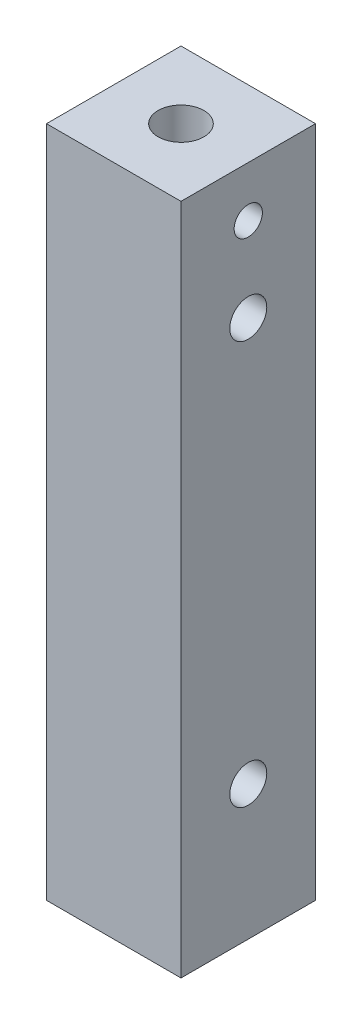
ISO-10303-21;
HEADER;
FILE_DESCRIPTION(('STEP AP214'),'2;1');
FILE_NAME('part.step','',(''),(''),'','','');
FILE_SCHEMA(('AUTOMOTIVE_DESIGN { 1 0 10303 214 1 1 1 1 }'));
ENDSEC;
DATA;
#1=APPLICATION_CONTEXT('core data for automotive mechanical design processes');
#2=APPLICATION_PROTOCOL_DEFINITION('international standard','automotive_design',2000,#1);
#3=PRODUCT_CONTEXT('',#1,'mechanical');
#4=PRODUCT('Part','Part','',(#3));
#5=PRODUCT_RELATED_PRODUCT_CATEGORY('part','',(#4));
#6=PRODUCT_DEFINITION_FORMATION('','',#4);
#7=PRODUCT_DEFINITION_CONTEXT('part definition',#1,'design');
#8=PRODUCT_DEFINITION('design','',#6,#7);
#9=PRODUCT_DEFINITION_SHAPE('','',#8);
#10=(LENGTH_UNIT() NAMED_UNIT(*) SI_UNIT(.MILLI.,.METRE.));
#11=(NAMED_UNIT(*) PLANE_ANGLE_UNIT() SI_UNIT($,.RADIAN.));
#12=(NAMED_UNIT(*) SI_UNIT($,.STERADIAN.) SOLID_ANGLE_UNIT());
#13=UNCERTAINTY_MEASURE_WITH_UNIT(LENGTH_MEASURE(1.E-05),#10,'distance_accuracy_value','');
#14=(GEOMETRIC_REPRESENTATION_CONTEXT(3) GLOBAL_UNCERTAINTY_ASSIGNED_CONTEXT((#13)) GLOBAL_UNIT_ASSIGNED_CONTEXT((#10,
#11,#12)) REPRESENTATION_CONTEXT('',''));
#15=CARTESIAN_POINT('',(0.,0.,0.));
#16=DIRECTION('',(0.,0.,1.));
#17=DIRECTION('',(1.,0.,0.));
#18=AXIS2_PLACEMENT_3D('',#15,#16,#17);
#19=CARTESIAN_POINT('',(20.,100.,0.));
#20=DIRECTION('',(-1.,0.,0.));
#21=DIRECTION('',(0.,0.,1.));
#22=AXIS2_PLACEMENT_3D('',#19,#20,#21);
#23=PLANE('',#22);
#24=CARTESIAN_POINT('',(20.,80.,-10.));
#25=DIRECTION('',(1.,0.,0.));
#26=DIRECTION('',(0.,0.,-1.));
#27=AXIS2_PLACEMENT_3D('',#24,#25,#26);
#28=CIRCLE('',#27,2.75);
#29=CARTESIAN_POINT('',(20.,80.,-12.75));
#30=VERTEX_POINT('',#29);
#31=EDGE_CURVE('E203',#30,#30,#28,.T.);
#32=ORIENTED_EDGE('',*,*,#31,.F.);
#33=EDGE_LOOP('',(#32));
#34=FACE_BOUND('',#33,.T.);
#35=CARTESIAN_POINT('',(20.,20.,-10.));
#36=DIRECTION('',(1.,0.,0.));
#37=DIRECTION('',(0.,0.,-1.));
#38=AXIS2_PLACEMENT_3D('',#35,#36,#37);
#39=CIRCLE('',#38,2.75);
#40=CARTESIAN_POINT('',(20.,20.,-12.75));
#41=VERTEX_POINT('',#40);
#42=EDGE_CURVE('E206',#41,#41,#39,.T.);
#43=ORIENTED_EDGE('',*,*,#42,.F.);
#44=EDGE_LOOP('',(#43));
#45=FACE_BOUND('',#44,.T.);
#46=DIRECTION('',(0.,0.,-1.));
#47=VECTOR('',#46,1.);
#48=CARTESIAN_POINT('',(20.,0.,0.));
#49=LINE('',#48,#47);
#50=CARTESIAN_POINT('',(20.,0.,0.));
#51=VERTEX_POINT('',#50);
#52=CARTESIAN_POINT('',(20.,0.,-20.));
#53=VERTEX_POINT('',#52);
#54=EDGE_CURVE('E98',#51,#53,#49,.T.);
#55=ORIENTED_EDGE('',*,*,#54,.T.);
#56=DIRECTION('',(0.,-1.,0.));
#57=VECTOR('',#56,1.);
#58=CARTESIAN_POINT('',(20.,100.,-20.));
#59=LINE('',#58,#57);
#60=CARTESIAN_POINT('',(20.,100.,-20.));
#61=VERTEX_POINT('',#60);
#62=EDGE_CURVE('E169',#61,#53,#59,.T.);
#63=ORIENTED_EDGE('',*,*,#62,.F.);
#64=DIRECTION('',(0.,0.,-1.));
#65=VECTOR('',#64,1.);
#66=CARTESIAN_POINT('',(20.,100.,0.));
#67=LINE('',#66,#65);
#68=CARTESIAN_POINT('',(20.,100.,0.));
#69=VERTEX_POINT('',#68);
#70=EDGE_CURVE('E151',#69,#61,#67,.T.);
#71=ORIENTED_EDGE('',*,*,#70,.F.);
#72=DIRECTION('',(0.,-1.,0.));
#73=VECTOR('',#72,1.);
#74=CARTESIAN_POINT('',(20.,100.,0.));
#75=LINE('',#74,#73);
#76=EDGE_CURVE('E72',#69,#51,#75,.T.);
#77=ORIENTED_EDGE('',*,*,#76,.T.);
#78=EDGE_LOOP('',(#55,#63,#71,#77));
#79=FACE_BOUND('',#78,.T.);
#80=CARTESIAN_POINT('',(20.,92.5,-10.));
#81=DIRECTION('',(1.,0.,0.));
#82=DIRECTION('',(0.,0.,-1.));
#83=AXIS2_PLACEMENT_3D('',#80,#81,#82);
#84=CIRCLE('',#83,2.09999999999999);
#85=CARTESIAN_POINT('',(20.,92.5,-12.1));
#86=VERTEX_POINT('',#85);
#87=EDGE_CURVE('E219',#86,#86,#84,.T.);
#88=ORIENTED_EDGE('',*,*,#87,.F.);
#89=EDGE_LOOP('',(#88));
#90=FACE_BOUND('',#89,.T.);
#91=ADVANCED_FACE('F56',(#34,#45,#79,#90),#23,.F.);
#92=CARTESIAN_POINT('',(0.,100.,0.));
#93=DIRECTION('',(1.,0.,0.));
#94=DIRECTION('',(0.,0.,-1.));
#95=AXIS2_PLACEMENT_3D('',#92,#93,#94);
#96=PLANE('',#95);
#97=CARTESIAN_POINT('',(0.,80.,-10.));
#98=DIRECTION('',(1.,0.,0.));
#99=DIRECTION('',(0.,0.,-1.));
#100=AXIS2_PLACEMENT_3D('',#97,#98,#99);
#101=CIRCLE('',#100,2.74999999999999);
#102=CARTESIAN_POINT('',(0.,80.,-12.75));
#103=VERTEX_POINT('',#102);
#104=EDGE_CURVE('E209',#103,#103,#101,.T.);
#105=ORIENTED_EDGE('',*,*,#104,.T.);
#106=EDGE_LOOP('',(#105));
#107=FACE_BOUND('',#106,.T.);
#108=CARTESIAN_POINT('',(0.,20.,-10.));
#109=DIRECTION('',(1.,0.,0.));
#110=DIRECTION('',(0.,0.,-1.));
#111=AXIS2_PLACEMENT_3D('',#108,#109,#110);
#112=CIRCLE('',#111,2.75);
#113=CARTESIAN_POINT('',(0.,20.,-12.75));
#114=VERTEX_POINT('',#113);
#115=EDGE_CURVE('E138',#114,#114,#112,.T.);
#116=ORIENTED_EDGE('',*,*,#115,.T.);
#117=EDGE_LOOP('',(#116));
#118=FACE_BOUND('',#117,.T.);
#119=DIRECTION('',(0.,0.,1.));
#120=VECTOR('',#119,1.);
#121=CARTESIAN_POINT('',(0.,0.,0.));
#122=LINE('',#121,#120);
#123=CARTESIAN_POINT('',(0.,0.,-20.));
#124=VERTEX_POINT('',#123);
#125=CARTESIAN_POINT('',(0.,0.,0.));
#126=VERTEX_POINT('',#125);
#127=EDGE_CURVE('E145',#124,#126,#122,.T.);
#128=ORIENTED_EDGE('',*,*,#127,.T.);
#129=DIRECTION('',(0.,-1.,0.));
#130=VECTOR('',#129,1.);
#131=CARTESIAN_POINT('',(0.,100.,0.));
#132=LINE('',#131,#130);
#133=CARTESIAN_POINT('',(0.,100.,0.));
#134=VERTEX_POINT('',#133);
#135=EDGE_CURVE('E13',#134,#126,#132,.T.);
#136=ORIENTED_EDGE('',*,*,#135,.F.);
#137=DIRECTION('',(0.,0.,1.));
#138=VECTOR('',#137,1.);
#139=CARTESIAN_POINT('',(0.,100.,0.));
#140=LINE('',#139,#138);
#141=CARTESIAN_POINT('',(0.,100.,-20.));
#142=VERTEX_POINT('',#141);
#143=EDGE_CURVE('E146',#142,#134,#140,.T.);
#144=ORIENTED_EDGE('',*,*,#143,.F.);
#145=DIRECTION('',(0.,-1.,0.));
#146=VECTOR('',#145,1.);
#147=CARTESIAN_POINT('',(0.,100.,-20.));
#148=LINE('',#147,#146);
#149=EDGE_CURVE('E156',#142,#124,#148,.T.);
#150=ORIENTED_EDGE('',*,*,#149,.T.);
#151=EDGE_LOOP('',(#128,#136,#144,#150));
#152=FACE_BOUND('',#151,.T.);
#153=ADVANCED_FACE('F58',(#107,#118,#152),#96,.F.);
#154=CARTESIAN_POINT('',(0.,100.,0.));
#155=DIRECTION('',(0.,0.,-1.));
#156=DIRECTION('',(-1.,0.,0.));
#157=AXIS2_PLACEMENT_3D('',#154,#155,#156);
#158=PLANE('',#157);
#159=DIRECTION('',(1.,0.,0.));
#160=VECTOR('',#159,1.);
#161=CARTESIAN_POINT('',(0.,0.,0.));
#162=LINE('',#161,#160);
#163=EDGE_CURVE('E160',#126,#51,#162,.T.);
#164=ORIENTED_EDGE('',*,*,#163,.T.);
#165=ORIENTED_EDGE('',*,*,#76,.F.);
#166=DIRECTION('',(1.,0.,0.));
#167=VECTOR('',#166,1.);
#168=CARTESIAN_POINT('',(0.,100.,0.));
#169=LINE('',#168,#167);
#170=EDGE_CURVE('E111',#134,#69,#169,.T.);
#171=ORIENTED_EDGE('',*,*,#170,.F.);
#172=ORIENTED_EDGE('',*,*,#135,.T.);
#173=EDGE_LOOP('',(#164,#165,#171,#172));
#174=FACE_BOUND('',#173,.T.);
#175=ADVANCED_FACE('F184',(#174),#158,.F.);
#176=CARTESIAN_POINT('',(0.,100.,-20.));
#177=DIRECTION('',(0.,0.,1.));
#178=DIRECTION('',(1.,0.,0.));
#179=AXIS2_PLACEMENT_3D('',#176,#177,#178);
#180=PLANE('',#179);
#181=DIRECTION('',(-1.,0.,0.));
#182=VECTOR('',#181,1.);
#183=CARTESIAN_POINT('',(0.,0.,-20.));
#184=LINE('',#183,#182);
#185=EDGE_CURVE('E104',#53,#124,#184,.T.);
#186=ORIENTED_EDGE('',*,*,#185,.T.);
#187=ORIENTED_EDGE('',*,*,#149,.F.);
#188=DIRECTION('',(-1.,0.,0.));
#189=VECTOR('',#188,1.);
#190=CARTESIAN_POINT('',(0.,100.,-20.));
#191=LINE('',#190,#189);
#192=EDGE_CURVE('E80',#61,#142,#191,.T.);
#193=ORIENTED_EDGE('',*,*,#192,.F.);
#194=ORIENTED_EDGE('',*,*,#62,.T.);
#195=EDGE_LOOP('',(#186,#187,#193,#194));
#196=FACE_BOUND('',#195,.T.);
#197=ADVANCED_FACE('F181',(#196),#180,.F.);
#198=CARTESIAN_POINT('',(0.,100.,0.));
#199=DIRECTION('',(0.,-1.,0.));
#200=DIRECTION('',(0.,0.,-1.));
#201=AXIS2_PLACEMENT_3D('',#198,#199,#200);
#202=PLANE('',#201);
#203=CARTESIAN_POINT('',(10.,100.,-10.));
#204=DIRECTION('',(0.,1.,0.));
#205=DIRECTION('',(0.,0.,1.));
#206=AXIS2_PLACEMENT_3D('',#203,#204,#205);
#207=CIRCLE('',#206,3.39999999999999);
#208=CARTESIAN_POINT('',(10.,100.,-6.60000000000001));
#209=VERTEX_POINT('',#208);
#210=EDGE_CURVE('E129',#209,#209,#207,.T.);
#211=ORIENTED_EDGE('',*,*,#210,.F.);
#212=EDGE_LOOP('',(#211));
#213=FACE_BOUND('',#212,.T.);
#214=ORIENTED_EDGE('',*,*,#143,.T.);
#215=ORIENTED_EDGE('',*,*,#170,.T.);
#216=ORIENTED_EDGE('',*,*,#70,.T.);
#217=ORIENTED_EDGE('',*,*,#192,.T.);
#218=EDGE_LOOP('',(#214,#215,#216,#217));
#219=FACE_BOUND('',#218,.T.);
#220=ADVANCED_FACE('F183',(#213,#219),#202,.F.);
#221=CARTESIAN_POINT('',(0.,0.,0.));
#222=DIRECTION('',(0.,-1.,0.));
#223=DIRECTION('',(0.,0.,-1.));
#224=AXIS2_PLACEMENT_3D('',#221,#222,#223);
#225=PLANE('',#224);
#226=CARTESIAN_POINT('',(10.,0.,-10.));
#227=DIRECTION('',(0.,-1.,0.));
#228=DIRECTION('',(0.,0.,-1.));
#229=AXIS2_PLACEMENT_3D('',#226,#227,#228);
#230=CIRCLE('',#229,3.39999999999999);
#231=CARTESIAN_POINT('',(10.,0.,-13.4));
#232=VERTEX_POINT('',#231);
#233=EDGE_CURVE('E130',#232,#232,#230,.T.);
#234=ORIENTED_EDGE('',*,*,#233,.F.);
#235=EDGE_LOOP('',(#234));
#236=FACE_BOUND('',#235,.T.);
#237=ORIENTED_EDGE('',*,*,#127,.F.);
#238=ORIENTED_EDGE('',*,*,#185,.F.);
#239=ORIENTED_EDGE('',*,*,#54,.F.);
#240=ORIENTED_EDGE('',*,*,#163,.F.);
#241=EDGE_LOOP('',(#237,#238,#239,#240));
#242=FACE_BOUND('',#241,.T.);
#243=ADVANCED_FACE('F177',(#236,#242),#225,.T.);
#244=CARTESIAN_POINT('',(10.,86.25,-10.));
#245=DIRECTION('',(0.,1.,0.));
#246=DIRECTION('',(0.,0.,1.));
#247=AXIS2_PLACEMENT_3D('',#244,#245,#246);
#248=CONICAL_SURFACE('',#247,3.4,1.02974425867665);
#249=CARTESIAN_POINT('',(10.,84.2070738953063,-10.));
#250=VERTEX_POINT('',#249);
#251=VERTEX_LOOP('',#250);
#252=FACE_BOUND('',#251,.T.);
#253=CARTESIAN_POINT('',(10.,86.25,-10.));
#254=DIRECTION('',(0.,1.,0.));
#255=DIRECTION('',(0.,0.,1.));
#256=AXIS2_PLACEMENT_3D('',#253,#254,#255);
#257=CIRCLE('',#256,3.4);
#258=CARTESIAN_POINT('',(10.,86.25,-6.6));
#259=VERTEX_POINT('',#258);
#260=EDGE_CURVE('E135',#259,#259,#257,.T.);
#261=ORIENTED_EDGE('',*,*,#260,.T.);
#262=EDGE_LOOP('',(#261));
#263=FACE_BOUND('',#262,.T.);
#264=ADVANCED_FACE('F248',(#252,#263),#248,.F.);
#265=CARTESIAN_POINT('',(10.,100.,-10.));
#266=DIRECTION('',(0.,1.,0.));
#267=DIRECTION('',(0.,0.,1.));
#268=AXIS2_PLACEMENT_3D('',#265,#266,#267);
#269=CYLINDRICAL_SURFACE('',#268,3.39999999999999);
#270=CARTESIAN_POINT('',(12.6739483914242,92.5,-12.1));
#271=CARTESIAN_POINT('',(12.6739610113809,92.6046790422649,-12.0999918862109));
#272=CARTESIAN_POINT('',(12.6802093934933,92.7095349338581,-12.0921018484001));
#273=CARTESIAN_POINT('',(12.7041179400223,92.9157500842561,-12.0610919822798));
#274=CARTESIAN_POINT('',(12.7218106974976,93.0170984826818,-12.03792865267));
#275=CARTESIAN_POINT('',(12.7656635883293,93.212687802904,-11.9779929515485));
#276=CARTESIAN_POINT('',(12.7917515972957,93.3069811221234,-11.9413361311584));
#277=CARTESIAN_POINT('',(12.8493313139399,93.4879607741085,-11.8557922033485));
#278=CARTESIAN_POINT('',(12.8808229339303,93.5746472302804,-11.8069052943872));
#279=CARTESIAN_POINT('',(12.9506272563945,93.7504142227042,-11.6908448141345));
#280=CARTESIAN_POINT('',(12.9892936162628,93.8383282426312,-11.6221166664703));
#281=CARTESIAN_POINT('',(13.066244140119,94.002364895129,-11.471499746558));
#282=CARTESIAN_POINT('',(13.1045279499978,94.0784774066945,-11.3895997994133));
#283=CARTESIAN_POINT('',(13.1816928729535,94.2255535136014,-11.2033807878212));
#284=CARTESIAN_POINT('',(13.2201215347832,94.2948775370383,-11.0975604931066));
#285=CARTESIAN_POINT('',(13.2881161066096,94.4141866571041,-10.8729325645918));
#286=CARTESIAN_POINT('',(13.3176906093381,94.4641905172374,-10.7541376761469));
#287=CARTESIAN_POINT('',(13.3619898388173,94.5380765317753,-10.5194501278611));
#288=CARTESIAN_POINT('',(13.3779023013162,94.5640681175731,-10.4044517052661));
#289=CARTESIAN_POINT('',(13.3977266634575,94.5963582842278,-10.1707458527));
#290=CARTESIAN_POINT('',(13.4016507757289,94.6026769062171,-10.0520423218078));
#291=CARTESIAN_POINT('',(13.3973621468313,94.5957252227632,-9.83111484709011));
#292=CARTESIAN_POINT('',(13.3906738354962,94.5849156093678,-9.72877157867804));
#293=CARTESIAN_POINT('',(13.3685524008778,94.5487437034368,-9.52768240010947));
#294=CARTESIAN_POINT('',(13.3531186165895,94.5233803108879,-9.42893676247154));
#295=CARTESIAN_POINT('',(13.3147611731353,94.4591591905625,-9.2371294578897));
#296=CARTESIAN_POINT('',(13.2918109413459,94.4202535562897,-9.14408936760809));
#297=CARTESIAN_POINT('',(13.240216227837,94.330396912274,-8.9657727888472));
#298=CARTESIAN_POINT('',(13.2115703972853,94.2794430487265,-8.88049814636992));
#299=CARTESIAN_POINT('',(13.1468103551656,94.1598943130799,-8.70887822165667));
#300=CARTESIAN_POINT('',(13.110210899813,94.0899002874422,-8.62369211380303));
#301=CARTESIAN_POINT('',(13.0353070639468,93.9378696879567,-8.46553324266295));
#302=CARTESIAN_POINT('',(12.9970003058399,93.8558159298707,-8.39257823072271));
#303=CARTESIAN_POINT('',(12.9172699365886,93.6697924521677,-8.25160644067956));
#304=CARTESIAN_POINT('',(12.8760633094271,93.5643637183163,-8.18537563860498));
#305=CARTESIAN_POINT('',(12.8012350353127,93.3413426628532,-8.07186022026547));
#306=CARTESIAN_POINT('',(12.7675994144318,93.223773344487,-8.02454057203247));
#307=CARTESIAN_POINT('',(12.7208691431286,93.0108290962125,-7.96088034392542));
#308=CARTESIAN_POINT('',(12.7047118444924,92.9175782569115,-7.93969282147629));
#309=CARTESIAN_POINT('',(12.6820051729033,92.7279605332538,-7.91021323543647));
#310=CARTESIAN_POINT('',(12.6754432686795,92.6315978813246,-7.90190435191258));
#311=CARTESIAN_POINT('',(12.6729104384627,92.4383121114321,-7.89867751792015));
#312=CARTESIAN_POINT('',(12.6769607180975,92.3413882580298,-7.90378637929588));
#313=CARTESIAN_POINT('',(12.6950614050933,92.1500630856571,-7.92711560222271));
#314=CARTESIAN_POINT('',(12.7091200074543,92.0556638996974,-7.94534670864642));
#315=CARTESIAN_POINT('',(12.7450682555591,91.8728091144794,-7.99363976553352));
#316=CARTESIAN_POINT('',(12.7668645006656,91.7842969648962,-8.02356102035896));
#317=CARTESIAN_POINT('',(12.8159349110133,91.6133144224336,-8.09412642881083));
#318=CARTESIAN_POINT('',(12.8432110496868,91.5308462207589,-8.13477444704282));
#319=CARTESIAN_POINT('',(12.9063404658083,91.3578657703768,-8.23441892944316));
#320=CARTESIAN_POINT('',(12.9428427274776,91.2687487177414,-8.29542726120125));
#321=CARTESIAN_POINT('',(13.0168519494701,91.1010496492953,-8.43012020496833));
#322=CARTESIAN_POINT('',(13.054359899438,91.022478504535,-8.5038177214851));
#323=CARTESIAN_POINT('',(13.1328154767844,90.8660539623924,-8.67500661525418));
#324=CARTESIAN_POINT('',(13.1734271197786,90.7901009318167,-8.77441051895031));
#325=CARTESIAN_POINT('',(13.2475568998873,90.6561635998003,-8.98707116473592));
#326=CARTESIAN_POINT('',(13.2810788277191,90.5981696882674,-9.10032045261941));
#327=CARTESIAN_POINT('',(13.3353363755056,90.5060689587725,-9.33024899176576));
#328=CARTESIAN_POINT('',(13.3567541488414,90.4706687092271,-9.4462424570589));
#329=CARTESIAN_POINT('',(13.3874057558049,90.4203541943052,-9.68409821455821));
#330=CARTESIAN_POINT('',(13.3966555087029,90.4054131613394,-9.80595262205689));
#331=CARTESIAN_POINT('',(13.4014597623096,90.3976384670894,-10.0330383947485));
#332=CARTESIAN_POINT('',(13.3987889817109,90.4019401913647,-10.1381460376771));
#333=CARTESIAN_POINT('',(13.3839630939261,90.4260428241202,-10.3458728477988));
#334=CARTESIAN_POINT('',(13.3718082345418,90.4458433276457,-10.4484920799374));
#335=CARTESIAN_POINT('',(13.3396154688397,90.4991340110817,-10.6454911504911));
#336=CARTESIAN_POINT('',(13.3198153371844,90.532212362581,-10.7400233456937));
#337=CARTESIAN_POINT('',(13.2739090433057,90.6106901269537,-10.922143552682));
#338=CARTESIAN_POINT('',(13.2478017369723,90.6560917754355,-11.0097303007431));
#339=CARTESIAN_POINT('',(13.1881238288334,90.7632436410302,-11.1854800532095));
#340=CARTESIAN_POINT('',(13.1540563289322,90.8262136512459,-11.2727280617522));
#341=CARTESIAN_POINT('',(13.0831244438956,90.9640474197628,-11.4360679887891));
#342=CARTESIAN_POINT('',(13.0462568771564,91.0389248168529,-11.512146919613));
#343=CARTESIAN_POINT('',(12.9674989061893,91.2105546571169,-11.6619450439946));
#344=CARTESIAN_POINT('',(12.9256248935749,91.3089014658815,-11.7338562184168));
#345=CARTESIAN_POINT('',(12.8469003300844,91.518071264668,-11.8602991106615));
#346=CARTESIAN_POINT('',(12.8100465287888,91.6288860963634,-11.9148421047012));
#347=CARTESIAN_POINT('',(12.7539696421629,91.8352455007145,-11.9943606043632));
#348=CARTESIAN_POINT('',(12.7326491293437,91.928726344706,-12.0232107820716));
#349=CARTESIAN_POINT('',(12.6991564682664,92.1202149923477,-12.0676922720582));
#350=CARTESIAN_POINT('',(12.6869547102251,92.2182070373912,-12.0833663895992));
#351=CARTESIAN_POINT('',(12.678123788191,92.3474268383536,-12.0946737200208));
#352=CARTESIAN_POINT('',(12.6765623606121,92.3778791296385,-12.0966682254729));
#353=CARTESIAN_POINT('',(12.6744727064262,92.4388825741913,-12.0993326953104));
#354=CARTESIAN_POINT('',(12.6739447064002,92.4694337476689,-12.1000023692242));
#355=CARTESIAN_POINT('',(12.6739483914242,92.5,-12.1));
#356=B_SPLINE_CURVE_WITH_KNOTS('',3,(#270,#271,#272,#273,#274,#275,#276,#277,#278,#279,#280,
#281,#282,#283,#284,#285,#286,#287,#288,#289,#290,#291,#292,#293,#294,#295,#296,#297,#298,#299,
#300,#301,#302,#303,#304,#305,#306,#307,#308,#309,#310,#311,#312,#313,#314,#315,#316,#317,#318,
#319,#320,#321,#322,#323,#324,#325,#326,#327,#328,#329,#330,#331,#332,#333,#334,#335,#336,#337,
#338,#339,#340,#341,#342,#343,#344,#345,#346,#347,#348,#349,#350,#351,#352,#353,#354,#355),
.UNSPECIFIED.,.T.,.F.,(4,2,2,2,2,2,2,2,2,2,2,2,2,2,2,2,2,2,2,2,2,2,2,2,2,2,2,2,2,2,2,2,2,2,2,2,
2,2,2,2,2,2,4),(0.,0.313896674080749,0.628691271189519,0.940850572197414,1.25300480810621,
1.60593606393231,1.95916834011229,2.35365557858265,2.74775872708061,3.10251754660727,
3.45691484975307,3.76482728319473,4.07276299254453,4.38179930392576,4.69090888867311,
5.03805048771669,5.38569162203661,5.77721782858878,6.16801535263559,6.45774015320214,
6.74708624369568,7.03701095616055,7.32717333780365,7.61394604878348,7.90082221874779,
8.2415400699277,8.58260648958722,8.97518072262445,9.36754452107266,9.73474456608872,
10.1014637284882,10.4155612411155,10.7296505472233,11.0346698888152,11.3397446019588,
11.6770205140648,12.0146855639624,12.3994308421803,12.7839258144403,13.0831499023243,
13.3813980978601,13.4730357532148,13.5646934980532),.UNSPECIFIED.);
#357=CARTESIAN_POINT('',(12.6739483914242,92.5,-12.1));
#358=VERTEX_POINT('',#357);
#359=EDGE_CURVE('E60',#358,#358,#356,.T.);
#360=ORIENTED_EDGE('',*,*,#359,.T.);
#361=EDGE_LOOP('',(#360));
#362=FACE_BOUND('',#361,.T.);
#363=ORIENTED_EDGE('',*,*,#260,.F.);
#364=EDGE_LOOP('',(#363));
#365=FACE_BOUND('',#364,.T.);
#366=ORIENTED_EDGE('',*,*,#210,.T.);
#367=EDGE_LOOP('',(#366));
#368=FACE_BOUND('',#367,.T.);
#369=ADVANCED_FACE('F122',(#362,#365,#368),#269,.F.);
#370=CARTESIAN_POINT('',(10.,13.75,-10.));
#371=DIRECTION('',(0.,-1.,0.));
#372=DIRECTION('',(0.,0.,-1.));
#373=AXIS2_PLACEMENT_3D('',#370,#371,#372);
#374=CONICAL_SURFACE('',#373,3.4,1.02974425867665);
#375=CARTESIAN_POINT('',(10.,15.7929261046937,-10.));
#376=VERTEX_POINT('',#375);
#377=VERTEX_LOOP('',#376);
#378=FACE_BOUND('',#377,.T.);
#379=CARTESIAN_POINT('',(10.,13.75,-10.));
#380=DIRECTION('',(0.,-1.,0.));
#381=DIRECTION('',(0.,0.,-1.));
#382=AXIS2_PLACEMENT_3D('',#379,#380,#381);
#383=CIRCLE('',#382,3.4);
#384=CARTESIAN_POINT('',(10.,13.75,-13.4));
#385=VERTEX_POINT('',#384);
#386=EDGE_CURVE('E126',#385,#385,#383,.T.);
#387=ORIENTED_EDGE('',*,*,#386,.T.);
#388=EDGE_LOOP('',(#387));
#389=FACE_BOUND('',#388,.T.);
#390=ADVANCED_FACE('F118',(#378,#389),#374,.F.);
#391=CARTESIAN_POINT('',(10.,0.,-10.));
#392=DIRECTION('',(0.,-1.,0.));
#393=DIRECTION('',(0.,0.,-1.));
#394=AXIS2_PLACEMENT_3D('',#391,#392,#393);
#395=CYLINDRICAL_SURFACE('',#394,3.39999999999999);
#396=ORIENTED_EDGE('',*,*,#386,.F.);
#397=EDGE_LOOP('',(#396));
#398=FACE_BOUND('',#397,.T.);
#399=ORIENTED_EDGE('',*,*,#233,.T.);
#400=EDGE_LOOP('',(#399));
#401=FACE_BOUND('',#400,.T.);
#402=ADVANCED_FACE('F121',(#398,#401),#395,.F.);
#403=CARTESIAN_POINT('',(20.,20.,-10.));
#404=DIRECTION('',(1.,0.,0.));
#405=DIRECTION('',(0.,0.,-1.));
#406=AXIS2_PLACEMENT_3D('',#403,#404,#405);
#407=CYLINDRICAL_SURFACE('',#406,2.75);
#408=ORIENTED_EDGE('',*,*,#115,.F.);
#409=EDGE_LOOP('',(#408));
#410=FACE_BOUND('',#409,.T.);
#411=ORIENTED_EDGE('',*,*,#42,.T.);
#412=EDGE_LOOP('',(#411));
#413=FACE_BOUND('',#412,.T.);
#414=ADVANCED_FACE('F236',(#410,#413),#407,.F.);
#415=CARTESIAN_POINT('',(20.,80.,-10.));
#416=DIRECTION('',(1.,0.,0.));
#417=DIRECTION('',(0.,0.,-1.));
#418=AXIS2_PLACEMENT_3D('',#415,#416,#417);
#419=CYLINDRICAL_SURFACE('',#418,2.75);
#420=ORIENTED_EDGE('',*,*,#104,.F.);
#421=EDGE_LOOP('',(#420));
#422=FACE_BOUND('',#421,.T.);
#423=ORIENTED_EDGE('',*,*,#31,.T.);
#424=EDGE_LOOP('',(#423));
#425=FACE_BOUND('',#424,.T.);
#426=ADVANCED_FACE('F232',(#422,#425),#419,.F.);
#427=CARTESIAN_POINT('',(20.,92.5,-10.));
#428=DIRECTION('',(1.,0.,0.));
#429=DIRECTION('',(0.,0.,-1.));
#430=AXIS2_PLACEMENT_3D('',#427,#428,#429);
#431=CYLINDRICAL_SURFACE('',#430,2.09999999999999);
#432=ORIENTED_EDGE('',*,*,#87,.T.);
#433=EDGE_LOOP('',(#432));
#434=FACE_BOUND('',#433,.T.);
#435=ORIENTED_EDGE('',*,*,#359,.F.);
#436=EDGE_LOOP('',(#435));
#437=FACE_BOUND('',#436,.T.);
#438=ADVANCED_FACE('F230',(#434,#437),#431,.F.);
#439=CLOSED_SHELL('',(#91,#153,#175,#197,#220,#243,#264,#369,#390,#402,#414,#426,#438));
#440=MANIFOLD_SOLID_BREP('B2',#439);
#441=ADVANCED_BREP_SHAPE_REPRESENTATION('',(#18,#440),#14);
#442=SHAPE_DEFINITION_REPRESENTATION(#9,#441);
ENDSEC;
END-ISO-10303-21;
